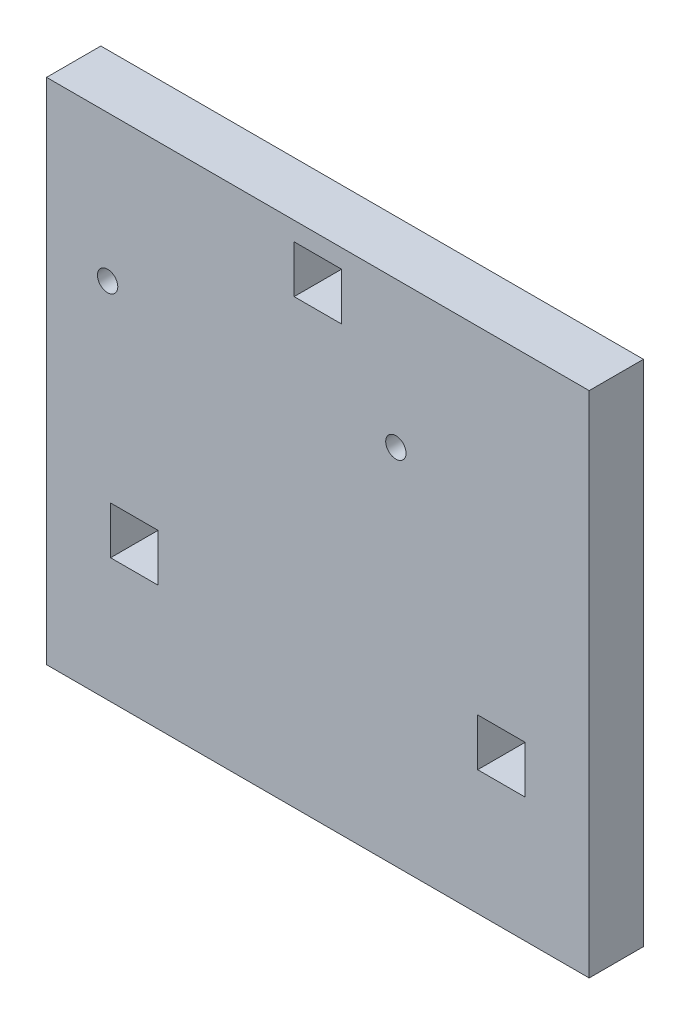
ISO-10303-21;
HEADER;
FILE_DESCRIPTION(('STEP AP214'),'2;1');
FILE_NAME('part.step','',(''),(''),'','','');
FILE_SCHEMA(('AUTOMOTIVE_DESIGN { 1 0 10303 214 1 1 1 1 }'));
ENDSEC;
DATA;
#1=APPLICATION_CONTEXT('core data for automotive mechanical design processes');
#2=APPLICATION_PROTOCOL_DEFINITION('international standard','automotive_design',2000,#1);
#3=PRODUCT_CONTEXT('',#1,'mechanical');
#4=PRODUCT('Part','Part','',(#3));
#5=PRODUCT_RELATED_PRODUCT_CATEGORY('part','',(#4));
#6=PRODUCT_DEFINITION_FORMATION('','',#4);
#7=PRODUCT_DEFINITION_CONTEXT('part definition',#1,'design');
#8=PRODUCT_DEFINITION('design','',#6,#7);
#9=PRODUCT_DEFINITION_SHAPE('','',#8);
#10=(LENGTH_UNIT() NAMED_UNIT(*) SI_UNIT(.MILLI.,.METRE.));
#11=(NAMED_UNIT(*) PLANE_ANGLE_UNIT() SI_UNIT($,.RADIAN.));
#12=(NAMED_UNIT(*) SI_UNIT($,.STERADIAN.) SOLID_ANGLE_UNIT());
#13=UNCERTAINTY_MEASURE_WITH_UNIT(LENGTH_MEASURE(1.E-05),#10,'distance_accuracy_value','');
#14=(GEOMETRIC_REPRESENTATION_CONTEXT(3) GLOBAL_UNCERTAINTY_ASSIGNED_CONTEXT((#13)) GLOBAL_UNIT_ASSIGNED_CONTEXT((#10,
#11,#12)) REPRESENTATION_CONTEXT('',''));
#15=CARTESIAN_POINT('',(0.,0.,0.));
#16=DIRECTION('',(0.,0.,1.));
#17=DIRECTION('',(1.,0.,0.));
#18=AXIS2_PLACEMENT_3D('',#15,#16,#17);
#19=CARTESIAN_POINT('',(0.,0.,16.));
#20=DIRECTION('',(-1.,0.,0.));
#21=DIRECTION('',(0.,-1.,0.));
#22=AXIS2_PLACEMENT_3D('',#19,#20,#21);
#23=PLANE('',#22);
#24=DIRECTION('',(0.,1.,0.));
#25=VECTOR('',#24,1.);
#26=CARTESIAN_POINT('',(0.,0.,0.));
#27=LINE('',#26,#25);
#28=CARTESIAN_POINT('',(0.,-150.,0.));
#29=VERTEX_POINT('',#28);
#30=CARTESIAN_POINT('',(0.,0.,0.));
#31=VERTEX_POINT('',#30);
#32=EDGE_CURVE('E186',#29,#31,#27,.T.);
#33=ORIENTED_EDGE('',*,*,#32,.T.);
#34=DIRECTION('',(0.,0.,-1.));
#35=VECTOR('',#34,1.);
#36=CARTESIAN_POINT('',(0.,0.,16.));
#37=LINE('',#36,#35);
#38=CARTESIAN_POINT('',(0.,0.,16.));
#39=VERTEX_POINT('',#38);
#40=EDGE_CURVE('E11',#39,#31,#37,.T.);
#41=ORIENTED_EDGE('',*,*,#40,.F.);
#42=DIRECTION('',(0.,1.,0.));
#43=VECTOR('',#42,1.);
#44=CARTESIAN_POINT('',(0.,0.,16.));
#45=LINE('',#44,#43);
#46=CARTESIAN_POINT('',(0.,-150.,16.));
#47=VERTEX_POINT('',#46);
#48=EDGE_CURVE('E252',#47,#39,#45,.T.);
#49=ORIENTED_EDGE('',*,*,#48,.F.);
#50=DIRECTION('',(0.,0.,-1.));
#51=VECTOR('',#50,1.);
#52=CARTESIAN_POINT('',(0.,-150.,16.));
#53=LINE('',#52,#51);
#54=EDGE_CURVE('E262',#47,#29,#53,.T.);
#55=ORIENTED_EDGE('',*,*,#54,.T.);
#56=EDGE_LOOP('',(#33,#41,#49,#55));
#57=FACE_BOUND('',#56,.T.);
#58=ADVANCED_FACE('F35',(#57),#23,.F.);
#59=CARTESIAN_POINT('',(0.,0.,16.));
#60=DIRECTION('',(0.,-1.,0.));
#61=DIRECTION('',(0.,0.,-1.));
#62=AXIS2_PLACEMENT_3D('',#59,#60,#61);
#63=PLANE('',#62);
#64=DIRECTION('',(-1.,0.,0.));
#65=VECTOR('',#64,1.);
#66=CARTESIAN_POINT('',(0.,0.,0.));
#67=LINE('',#66,#65);
#68=CARTESIAN_POINT('',(-160.,0.,0.));
#69=VERTEX_POINT('',#68);
#70=EDGE_CURVE('E265',#31,#69,#67,.T.);
#71=ORIENTED_EDGE('',*,*,#70,.T.);
#72=DIRECTION('',(0.,0.,-1.));
#73=VECTOR('',#72,1.);
#74=CARTESIAN_POINT('',(-160.,0.,16.));
#75=LINE('',#74,#73);
#76=CARTESIAN_POINT('',(-160.,0.,16.));
#77=VERTEX_POINT('',#76);
#78=EDGE_CURVE('E42',#77,#69,#75,.T.);
#79=ORIENTED_EDGE('',*,*,#78,.F.);
#80=DIRECTION('',(-1.,0.,0.));
#81=VECTOR('',#80,1.);
#82=CARTESIAN_POINT('',(0.,0.,16.));
#83=LINE('',#82,#81);
#84=EDGE_CURVE('E255',#39,#77,#83,.T.);
#85=ORIENTED_EDGE('',*,*,#84,.F.);
#86=ORIENTED_EDGE('',*,*,#40,.T.);
#87=EDGE_LOOP('',(#71,#79,#85,#86));
#88=FACE_BOUND('',#87,.T.);
#89=ADVANCED_FACE('F295',(#88),#63,.F.);
#90=CARTESIAN_POINT('',(-160.,0.,16.));
#91=DIRECTION('',(1.,0.,0.));
#92=DIRECTION('',(0.,1.,0.));
#93=AXIS2_PLACEMENT_3D('',#90,#91,#92);
#94=PLANE('',#93);
#95=DIRECTION('',(0.,-1.,0.));
#96=VECTOR('',#95,1.);
#97=CARTESIAN_POINT('',(-160.,0.,0.));
#98=LINE('',#97,#96);
#99=CARTESIAN_POINT('',(-160.,-150.,0.));
#100=VERTEX_POINT('',#99);
#101=EDGE_CURVE('E267',#69,#100,#98,.T.);
#102=ORIENTED_EDGE('',*,*,#101,.T.);
#103=DIRECTION('',(0.,0.,-1.));
#104=VECTOR('',#103,1.);
#105=CARTESIAN_POINT('',(-160.,-150.,16.));
#106=LINE('',#105,#104);
#107=CARTESIAN_POINT('',(-160.,-150.,16.));
#108=VERTEX_POINT('',#107);
#109=EDGE_CURVE('E272',#108,#100,#106,.T.);
#110=ORIENTED_EDGE('',*,*,#109,.F.);
#111=DIRECTION('',(0.,-1.,0.));
#112=VECTOR('',#111,1.);
#113=CARTESIAN_POINT('',(-160.,0.,16.));
#114=LINE('',#113,#112);
#115=EDGE_CURVE('E258',#77,#108,#114,.T.);
#116=ORIENTED_EDGE('',*,*,#115,.F.);
#117=ORIENTED_EDGE('',*,*,#78,.T.);
#118=EDGE_LOOP('',(#102,#110,#116,#117));
#119=FACE_BOUND('',#118,.T.);
#120=ADVANCED_FACE('F279',(#119),#94,.F.);
#121=CARTESIAN_POINT('',(0.,-150.,16.));
#122=DIRECTION('',(0.,1.,0.));
#123=DIRECTION('',(-1.,0.,0.));
#124=AXIS2_PLACEMENT_3D('',#121,#122,#123);
#125=PLANE('',#124);
#126=DIRECTION('',(1.,0.,0.));
#127=VECTOR('',#126,1.);
#128=CARTESIAN_POINT('',(0.,-150.,0.));
#129=LINE('',#128,#127);
#130=EDGE_CURVE('E256',#100,#29,#129,.T.);
#131=ORIENTED_EDGE('',*,*,#130,.T.);
#132=ORIENTED_EDGE('',*,*,#54,.F.);
#133=DIRECTION('',(1.,0.,0.));
#134=VECTOR('',#133,1.);
#135=CARTESIAN_POINT('',(0.,-150.,16.));
#136=LINE('',#135,#134);
#137=EDGE_CURVE('E260',#108,#47,#136,.T.);
#138=ORIENTED_EDGE('',*,*,#137,.F.);
#139=ORIENTED_EDGE('',*,*,#109,.T.);
#140=EDGE_LOOP('',(#131,#132,#138,#139));
#141=FACE_BOUND('',#140,.T.);
#142=ADVANCED_FACE('F288',(#141),#125,.F.);
#143=CARTESIAN_POINT('',(0.,0.,16.));
#144=DIRECTION('',(0.,0.,-1.));
#145=DIRECTION('',(-1.,0.,0.));
#146=AXIS2_PLACEMENT_3D('',#143,#144,#145);
#147=PLANE('',#146);
#148=CARTESIAN_POINT('',(-57.,-43.,16.));
#149=DIRECTION('',(0.,0.,1.));
#150=DIRECTION('',(1.,0.,0.));
#151=AXIS2_PLACEMENT_3D('',#148,#149,#150);
#152=CIRCLE('',#151,3.);
#153=CARTESIAN_POINT('',(-54.,-43.,16.));
#154=VERTEX_POINT('',#153);
#155=EDGE_CURVE('E378',#154,#154,#152,.T.);
#156=ORIENTED_EDGE('',*,*,#155,.F.);
#157=EDGE_LOOP('',(#156));
#158=FACE_BOUND('',#157,.T.);
#159=CARTESIAN_POINT('',(-142.,-43.,16.));
#160=DIRECTION('',(0.,0.,1.));
#161=DIRECTION('',(1.,0.,0.));
#162=AXIS2_PLACEMENT_3D('',#159,#160,#161);
#163=CIRCLE('',#162,2.99999999999999);
#164=CARTESIAN_POINT('',(-139.,-43.,16.));
#165=VERTEX_POINT('',#164);
#166=EDGE_CURVE('E173',#165,#165,#163,.T.);
#167=ORIENTED_EDGE('',*,*,#166,.F.);
#168=EDGE_LOOP('',(#167));
#169=FACE_BOUND('',#168,.T.);
#170=DIRECTION('',(1.,0.,0.));
#171=VECTOR('',#170,1.);
#172=CARTESIAN_POINT('',(-73.,-19.5,16.));
#173=LINE('',#172,#171);
#174=CARTESIAN_POINT('',(-87.,-19.5,16.));
#175=VERTEX_POINT('',#174);
#176=CARTESIAN_POINT('',(-73.,-19.5,16.));
#177=VERTEX_POINT('',#176);
#178=EDGE_CURVE('E179',#175,#177,#173,.T.);
#179=ORIENTED_EDGE('',*,*,#178,.F.);
#180=DIRECTION('',(0.,-1.,0.));
#181=VECTOR('',#180,1.);
#182=CARTESIAN_POINT('',(-87.,-5.50000000000002,16.));
#183=LINE('',#182,#181);
#184=CARTESIAN_POINT('',(-87.,-5.50000000000002,16.));
#185=VERTEX_POINT('',#184);
#186=EDGE_CURVE('E49',#185,#175,#183,.T.);
#187=ORIENTED_EDGE('',*,*,#186,.F.);
#188=DIRECTION('',(-1.,0.,0.));
#189=VECTOR('',#188,1.);
#190=CARTESIAN_POINT('',(-73.,-5.50000000000002,16.));
#191=LINE('',#190,#189);
#192=CARTESIAN_POINT('',(-73.,-5.50000000000002,16.));
#193=VERTEX_POINT('',#192);
#194=EDGE_CURVE('E167',#193,#185,#191,.T.);
#195=ORIENTED_EDGE('',*,*,#194,.F.);
#196=DIRECTION('',(0.,1.,0.));
#197=VECTOR('',#196,1.);
#198=CARTESIAN_POINT('',(-73.,-5.50000000000002,16.));
#199=LINE('',#198,#197);
#200=EDGE_CURVE('E170',#177,#193,#199,.T.);
#201=ORIENTED_EDGE('',*,*,#200,.F.);
#202=EDGE_LOOP('',(#179,#187,#195,#201));
#203=FACE_BOUND('',#202,.T.);
#204=DIRECTION('',(1.,0.,0.));
#205=VECTOR('',#204,1.);
#206=CARTESIAN_POINT('',(-127.126587736527,-113.25,16.));
#207=LINE('',#206,#205);
#208=CARTESIAN_POINT('',(-141.126587736527,-113.25,16.));
#209=VERTEX_POINT('',#208);
#210=CARTESIAN_POINT('',(-127.126587736527,-113.25,16.));
#211=VERTEX_POINT('',#210);
#212=EDGE_CURVE('E205',#209,#211,#207,.T.);
#213=ORIENTED_EDGE('',*,*,#212,.F.);
#214=DIRECTION('',(0.,-1.,0.));
#215=VECTOR('',#214,1.);
#216=CARTESIAN_POINT('',(-141.126587736527,-113.25,16.));
#217=LINE('',#216,#215);
#218=CARTESIAN_POINT('',(-141.126587736527,-99.25,16.));
#219=VERTEX_POINT('',#218);
#220=EDGE_CURVE('E57',#219,#209,#217,.T.);
#221=ORIENTED_EDGE('',*,*,#220,.F.);
#222=DIRECTION('',(-1.,0.,0.));
#223=VECTOR('',#222,1.);
#224=CARTESIAN_POINT('',(-127.126587736527,-99.25,16.));
#225=LINE('',#224,#223);
#226=CARTESIAN_POINT('',(-127.126587736527,-99.25,16.));
#227=VERTEX_POINT('',#226);
#228=EDGE_CURVE('E194',#227,#219,#225,.T.);
#229=ORIENTED_EDGE('',*,*,#228,.F.);
#230=DIRECTION('',(0.,1.,0.));
#231=VECTOR('',#230,1.);
#232=CARTESIAN_POINT('',(-127.126587736527,-113.25,16.));
#233=LINE('',#232,#231);
#234=EDGE_CURVE('E209',#211,#227,#233,.T.);
#235=ORIENTED_EDGE('',*,*,#234,.F.);
#236=EDGE_LOOP('',(#213,#221,#229,#235));
#237=FACE_BOUND('',#236,.T.);
#238=DIRECTION('',(1.,0.,0.));
#239=VECTOR('',#238,1.);
#240=CARTESIAN_POINT('',(-18.8734122634726,-113.25,16.));
#241=LINE('',#240,#239);
#242=CARTESIAN_POINT('',(-32.8734122634726,-113.25,16.));
#243=VERTEX_POINT('',#242);
#244=CARTESIAN_POINT('',(-18.8734122634726,-113.25,16.));
#245=VERTEX_POINT('',#244);
#246=EDGE_CURVE('E236',#243,#245,#241,.T.);
#247=ORIENTED_EDGE('',*,*,#246,.F.);
#248=DIRECTION('',(0.,-1.,0.));
#249=VECTOR('',#248,1.);
#250=CARTESIAN_POINT('',(-32.8734122634726,-113.25,16.));
#251=LINE('',#250,#249);
#252=CARTESIAN_POINT('',(-32.8734122634726,-99.25,16.));
#253=VERTEX_POINT('',#252);
#254=EDGE_CURVE('E234',#253,#243,#251,.T.);
#255=ORIENTED_EDGE('',*,*,#254,.F.);
#256=DIRECTION('',(-1.,0.,0.));
#257=VECTOR('',#256,1.);
#258=CARTESIAN_POINT('',(-18.8734122634726,-99.25,16.));
#259=LINE('',#258,#257);
#260=CARTESIAN_POINT('',(-18.8734122634726,-99.25,16.));
#261=VERTEX_POINT('',#260);
#262=EDGE_CURVE('E224',#261,#253,#259,.T.);
#263=ORIENTED_EDGE('',*,*,#262,.F.);
#264=DIRECTION('',(0.,1.,0.));
#265=VECTOR('',#264,1.);
#266=CARTESIAN_POINT('',(-18.8734122634726,-113.25,16.));
#267=LINE('',#266,#265);
#268=EDGE_CURVE('E240',#245,#261,#267,.T.);
#269=ORIENTED_EDGE('',*,*,#268,.F.);
#270=EDGE_LOOP('',(#247,#255,#263,#269));
#271=FACE_BOUND('',#270,.T.);
#272=ORIENTED_EDGE('',*,*,#48,.T.);
#273=ORIENTED_EDGE('',*,*,#84,.T.);
#274=ORIENTED_EDGE('',*,*,#115,.T.);
#275=ORIENTED_EDGE('',*,*,#137,.T.);
#276=EDGE_LOOP('',(#272,#273,#274,#275));
#277=FACE_BOUND('',#276,.T.);
#278=ADVANCED_FACE('F294',(#158,#169,#203,#237,#271,#277),#147,.F.);
#279=CARTESIAN_POINT('',(0.,0.,0.));
#280=DIRECTION('',(0.,0.,-1.));
#281=DIRECTION('',(-1.,0.,0.));
#282=AXIS2_PLACEMENT_3D('',#279,#280,#281);
#283=PLANE('',#282);
#284=CARTESIAN_POINT('',(-57.,-43.,0.));
#285=DIRECTION('',(0.,0.,1.));
#286=DIRECTION('',(1.,0.,0.));
#287=AXIS2_PLACEMENT_3D('',#284,#285,#286);
#288=CIRCLE('',#287,3.);
#289=CARTESIAN_POINT('',(-54.,-43.,0.));
#290=VERTEX_POINT('',#289);
#291=EDGE_CURVE('E237',#290,#290,#288,.T.);
#292=ORIENTED_EDGE('',*,*,#291,.T.);
#293=EDGE_LOOP('',(#292));
#294=FACE_BOUND('',#293,.T.);
#295=CARTESIAN_POINT('',(-142.,-43.,0.));
#296=DIRECTION('',(0.,0.,1.));
#297=DIRECTION('',(1.,0.,0.));
#298=AXIS2_PLACEMENT_3D('',#295,#296,#297);
#299=CIRCLE('',#298,2.99999999999999);
#300=CARTESIAN_POINT('',(-139.,-43.,0.));
#301=VERTEX_POINT('',#300);
#302=EDGE_CURVE('E379',#301,#301,#299,.T.);
#303=ORIENTED_EDGE('',*,*,#302,.T.);
#304=EDGE_LOOP('',(#303));
#305=FACE_BOUND('',#304,.T.);
#306=ORIENTED_EDGE('',*,*,#32,.F.);
#307=ORIENTED_EDGE('',*,*,#130,.F.);
#308=ORIENTED_EDGE('',*,*,#101,.F.);
#309=ORIENTED_EDGE('',*,*,#70,.F.);
#310=EDGE_LOOP('',(#306,#307,#308,#309));
#311=FACE_BOUND('',#310,.T.);
#312=ADVANCED_FACE('F285',(#294,#305,#311),#283,.T.);
#313=CARTESIAN_POINT('',(-32.8734122634726,-113.25,2.));
#314=DIRECTION('',(-1.,0.,0.));
#315=DIRECTION('',(0.,0.,1.));
#316=AXIS2_PLACEMENT_3D('',#313,#314,#315);
#317=PLANE('',#316);
#318=ORIENTED_EDGE('',*,*,#254,.T.);
#319=DIRECTION('',(0.,0.,1.));
#320=VECTOR('',#319,1.);
#321=CARTESIAN_POINT('',(-32.8734122634726,-113.25,2.));
#322=LINE('',#321,#320);
#323=CARTESIAN_POINT('',(-32.8734122634726,-113.25,2.));
#324=VERTEX_POINT('',#323);
#325=EDGE_CURVE('E233',#324,#243,#322,.T.);
#326=ORIENTED_EDGE('',*,*,#325,.F.);
#327=DIRECTION('',(0.,-1.,0.));
#328=VECTOR('',#327,1.);
#329=CARTESIAN_POINT('',(-32.8734122634726,-113.25,2.));
#330=LINE('',#329,#328);
#331=CARTESIAN_POINT('',(-32.8734122634726,-99.25,2.));
#332=VERTEX_POINT('',#331);
#333=EDGE_CURVE('E220',#332,#324,#330,.T.);
#334=ORIENTED_EDGE('',*,*,#333,.F.);
#335=DIRECTION('',(0.,0.,1.));
#336=VECTOR('',#335,1.);
#337=CARTESIAN_POINT('',(-32.8734122634726,-99.25,2.));
#338=LINE('',#337,#336);
#339=EDGE_CURVE('E206',#332,#253,#338,.T.);
#340=ORIENTED_EDGE('',*,*,#339,.T.);
#341=EDGE_LOOP('',(#318,#326,#334,#340));
#342=FACE_BOUND('',#341,.T.);
#343=ADVANCED_FACE('F307',(#342),#317,.F.);
#344=CARTESIAN_POINT('',(-18.8734122634726,-99.25,2.));
#345=DIRECTION('',(0.,1.,0.));
#346=DIRECTION('',(0.,0.,1.));
#347=AXIS2_PLACEMENT_3D('',#344,#345,#346);
#348=PLANE('',#347);
#349=ORIENTED_EDGE('',*,*,#262,.T.);
#350=ORIENTED_EDGE('',*,*,#339,.F.);
#351=DIRECTION('',(-1.,0.,0.));
#352=VECTOR('',#351,1.);
#353=CARTESIAN_POINT('',(-18.8734122634726,-99.25,2.));
#354=LINE('',#353,#352);
#355=CARTESIAN_POINT('',(-18.8734122634726,-99.25,2.));
#356=VERTEX_POINT('',#355);
#357=EDGE_CURVE('E230',#356,#332,#354,.T.);
#358=ORIENTED_EDGE('',*,*,#357,.F.);
#359=DIRECTION('',(0.,0.,1.));
#360=VECTOR('',#359,1.);
#361=CARTESIAN_POINT('',(-18.8734122634726,-99.25,2.));
#362=LINE('',#361,#360);
#363=EDGE_CURVE('E246',#356,#261,#362,.T.);
#364=ORIENTED_EDGE('',*,*,#363,.T.);
#365=EDGE_LOOP('',(#349,#350,#358,#364));
#366=FACE_BOUND('',#365,.T.);
#367=ADVANCED_FACE('F314',(#366),#348,.F.);
#368=CARTESIAN_POINT('',(-18.8734122634726,-113.25,2.));
#369=DIRECTION('',(1.,0.,0.));
#370=DIRECTION('',(0.,0.,-1.));
#371=AXIS2_PLACEMENT_3D('',#368,#369,#370);
#372=PLANE('',#371);
#373=ORIENTED_EDGE('',*,*,#268,.T.);
#374=ORIENTED_EDGE('',*,*,#363,.F.);
#375=DIRECTION('',(0.,1.,0.));
#376=VECTOR('',#375,1.);
#377=CARTESIAN_POINT('',(-18.8734122634726,-113.25,2.));
#378=LINE('',#377,#376);
#379=CARTESIAN_POINT('',(-18.8734122634726,-113.25,2.));
#380=VERTEX_POINT('',#379);
#381=EDGE_CURVE('E227',#380,#356,#378,.T.);
#382=ORIENTED_EDGE('',*,*,#381,.F.);
#383=DIRECTION('',(0.,0.,1.));
#384=VECTOR('',#383,1.);
#385=CARTESIAN_POINT('',(-18.8734122634726,-113.25,2.));
#386=LINE('',#385,#384);
#387=EDGE_CURVE('E248',#380,#245,#386,.T.);
#388=ORIENTED_EDGE('',*,*,#387,.T.);
#389=EDGE_LOOP('',(#373,#374,#382,#388));
#390=FACE_BOUND('',#389,.T.);
#391=ADVANCED_FACE('F320',(#390),#372,.F.);
#392=CARTESIAN_POINT('',(-18.8734122634726,-113.25,2.));
#393=DIRECTION('',(0.,-1.,0.));
#394=DIRECTION('',(0.,0.,-1.));
#395=AXIS2_PLACEMENT_3D('',#392,#393,#394);
#396=PLANE('',#395);
#397=ORIENTED_EDGE('',*,*,#246,.T.);
#398=ORIENTED_EDGE('',*,*,#387,.F.);
#399=DIRECTION('',(1.,0.,0.));
#400=VECTOR('',#399,1.);
#401=CARTESIAN_POINT('',(-18.8734122634726,-113.25,2.));
#402=LINE('',#401,#400);
#403=EDGE_CURVE('E223',#324,#380,#402,.T.);
#404=ORIENTED_EDGE('',*,*,#403,.F.);
#405=ORIENTED_EDGE('',*,*,#325,.T.);
#406=EDGE_LOOP('',(#397,#398,#404,#405));
#407=FACE_BOUND('',#406,.T.);
#408=ADVANCED_FACE('F316',(#407),#396,.F.);
#409=CARTESIAN_POINT('',(0.,0.,2.));
#410=DIRECTION('',(0.,0.,1.));
#411=DIRECTION('',(1.,0.,0.));
#412=AXIS2_PLACEMENT_3D('',#409,#410,#411);
#413=PLANE('',#412);
#414=ORIENTED_EDGE('',*,*,#333,.T.);
#415=ORIENTED_EDGE('',*,*,#403,.T.);
#416=ORIENTED_EDGE('',*,*,#381,.T.);
#417=ORIENTED_EDGE('',*,*,#357,.T.);
#418=EDGE_LOOP('',(#414,#415,#416,#417));
#419=FACE_BOUND('',#418,.T.);
#420=ADVANCED_FACE('F319',(#419),#413,.T.);
#421=CARTESIAN_POINT('',(-141.126587736527,-113.25,2.));
#422=DIRECTION('',(-1.,0.,0.));
#423=DIRECTION('',(0.,0.,1.));
#424=AXIS2_PLACEMENT_3D('',#421,#422,#423);
#425=PLANE('',#424);
#426=ORIENTED_EDGE('',*,*,#220,.T.);
#427=DIRECTION('',(0.,0.,1.));
#428=VECTOR('',#427,1.);
#429=CARTESIAN_POINT('',(-141.126587736527,-113.25,2.));
#430=LINE('',#429,#428);
#431=CARTESIAN_POINT('',(-141.126587736527,-113.25,2.));
#432=VERTEX_POINT('',#431);
#433=EDGE_CURVE('E203',#432,#209,#430,.T.);
#434=ORIENTED_EDGE('',*,*,#433,.F.);
#435=DIRECTION('',(0.,-1.,0.));
#436=VECTOR('',#435,1.);
#437=CARTESIAN_POINT('',(-141.126587736527,-113.25,2.));
#438=LINE('',#437,#436);
#439=CARTESIAN_POINT('',(-141.126587736527,-99.25,2.));
#440=VERTEX_POINT('',#439);
#441=EDGE_CURVE('E190',#440,#432,#438,.T.);
#442=ORIENTED_EDGE('',*,*,#441,.F.);
#443=DIRECTION('',(0.,0.,1.));
#444=VECTOR('',#443,1.);
#445=CARTESIAN_POINT('',(-141.126587736527,-99.25,2.));
#446=LINE('',#445,#444);
#447=EDGE_CURVE('E180',#440,#219,#446,.T.);
#448=ORIENTED_EDGE('',*,*,#447,.T.);
#449=EDGE_LOOP('',(#426,#434,#442,#448));
#450=FACE_BOUND('',#449,.T.);
#451=ADVANCED_FACE('F330',(#450),#425,.F.);
#452=CARTESIAN_POINT('',(-127.126587736527,-99.25,2.));
#453=DIRECTION('',(0.,1.,0.));
#454=DIRECTION('',(0.,0.,1.));
#455=AXIS2_PLACEMENT_3D('',#452,#453,#454);
#456=PLANE('',#455);
#457=ORIENTED_EDGE('',*,*,#228,.T.);
#458=ORIENTED_EDGE('',*,*,#447,.F.);
#459=DIRECTION('',(-1.,0.,0.));
#460=VECTOR('',#459,1.);
#461=CARTESIAN_POINT('',(-127.126587736527,-99.25,2.));
#462=LINE('',#461,#460);
#463=CARTESIAN_POINT('',(-127.126587736527,-99.25,2.));
#464=VERTEX_POINT('',#463);
#465=EDGE_CURVE('E200',#464,#440,#462,.T.);
#466=ORIENTED_EDGE('',*,*,#465,.F.);
#467=DIRECTION('',(0.,0.,1.));
#468=VECTOR('',#467,1.);
#469=CARTESIAN_POINT('',(-127.126587736527,-99.25,2.));
#470=LINE('',#469,#468);
#471=EDGE_CURVE('E215',#464,#227,#470,.T.);
#472=ORIENTED_EDGE('',*,*,#471,.T.);
#473=EDGE_LOOP('',(#457,#458,#466,#472));
#474=FACE_BOUND('',#473,.T.);
#475=ADVANCED_FACE('F334',(#474),#456,.F.);
#476=CARTESIAN_POINT('',(-127.126587736527,-113.25,2.));
#477=DIRECTION('',(1.,0.,0.));
#478=DIRECTION('',(0.,0.,-1.));
#479=AXIS2_PLACEMENT_3D('',#476,#477,#478);
#480=PLANE('',#479);
#481=ORIENTED_EDGE('',*,*,#234,.T.);
#482=ORIENTED_EDGE('',*,*,#471,.F.);
#483=DIRECTION('',(0.,1.,0.));
#484=VECTOR('',#483,1.);
#485=CARTESIAN_POINT('',(-127.126587736527,-113.25,2.));
#486=LINE('',#485,#484);
#487=CARTESIAN_POINT('',(-127.126587736527,-113.25,2.));
#488=VERTEX_POINT('',#487);
#489=EDGE_CURVE('E197',#488,#464,#486,.T.);
#490=ORIENTED_EDGE('',*,*,#489,.F.);
#491=DIRECTION('',(0.,0.,1.));
#492=VECTOR('',#491,1.);
#493=CARTESIAN_POINT('',(-127.126587736527,-113.25,2.));
#494=LINE('',#493,#492);
#495=EDGE_CURVE('E217',#488,#211,#494,.T.);
#496=ORIENTED_EDGE('',*,*,#495,.T.);
#497=EDGE_LOOP('',(#481,#482,#490,#496));
#498=FACE_BOUND('',#497,.T.);
#499=ADVANCED_FACE('F339',(#498),#480,.F.);
#500=CARTESIAN_POINT('',(-127.126587736527,-113.25,2.));
#501=DIRECTION('',(0.,-1.,0.));
#502=DIRECTION('',(0.,0.,-1.));
#503=AXIS2_PLACEMENT_3D('',#500,#501,#502);
#504=PLANE('',#503);
#505=ORIENTED_EDGE('',*,*,#212,.T.);
#506=ORIENTED_EDGE('',*,*,#495,.F.);
#507=DIRECTION('',(1.,0.,0.));
#508=VECTOR('',#507,1.);
#509=CARTESIAN_POINT('',(-127.126587736527,-113.25,2.));
#510=LINE('',#509,#508);
#511=EDGE_CURVE('E193',#432,#488,#510,.T.);
#512=ORIENTED_EDGE('',*,*,#511,.F.);
#513=ORIENTED_EDGE('',*,*,#433,.T.);
#514=EDGE_LOOP('',(#505,#506,#512,#513));
#515=FACE_BOUND('',#514,.T.);
#516=ADVANCED_FACE('F335',(#515),#504,.F.);
#517=CARTESIAN_POINT('',(0.,0.,2.));
#518=DIRECTION('',(0.,0.,1.));
#519=DIRECTION('',(1.,0.,0.));
#520=AXIS2_PLACEMENT_3D('',#517,#518,#519);
#521=PLANE('',#520);
#522=ORIENTED_EDGE('',*,*,#441,.T.);
#523=ORIENTED_EDGE('',*,*,#511,.T.);
#524=ORIENTED_EDGE('',*,*,#489,.T.);
#525=ORIENTED_EDGE('',*,*,#465,.T.);
#526=EDGE_LOOP('',(#522,#523,#524,#525));
#527=FACE_BOUND('',#526,.T.);
#528=ADVANCED_FACE('F338',(#527),#521,.T.);
#529=CARTESIAN_POINT('',(-87.,-5.50000000000002,2.));
#530=DIRECTION('',(-1.,0.,0.));
#531=DIRECTION('',(0.,0.,1.));
#532=AXIS2_PLACEMENT_3D('',#529,#530,#531);
#533=PLANE('',#532);
#534=ORIENTED_EDGE('',*,*,#186,.T.);
#535=DIRECTION('',(0.,0.,1.));
#536=VECTOR('',#535,1.);
#537=CARTESIAN_POINT('',(-87.,-19.5,2.));
#538=LINE('',#537,#536);
#539=CARTESIAN_POINT('',(-87.,-19.5,2.));
#540=VERTEX_POINT('',#539);
#541=EDGE_CURVE('E145',#540,#175,#538,.T.);
#542=ORIENTED_EDGE('',*,*,#541,.F.);
#543=DIRECTION('',(0.,-1.,0.));
#544=VECTOR('',#543,1.);
#545=CARTESIAN_POINT('',(-87.,-5.50000000000002,2.));
#546=LINE('',#545,#544);
#547=CARTESIAN_POINT('',(-87.,-5.50000000000002,2.));
#548=VERTEX_POINT('',#547);
#549=EDGE_CURVE('E149',#548,#540,#546,.T.);
#550=ORIENTED_EDGE('',*,*,#549,.F.);
#551=DIRECTION('',(0.,0.,1.));
#552=VECTOR('',#551,1.);
#553=CARTESIAN_POINT('',(-87.,-5.50000000000002,2.));
#554=LINE('',#553,#552);
#555=EDGE_CURVE('E184',#548,#185,#554,.T.);
#556=ORIENTED_EDGE('',*,*,#555,.T.);
#557=EDGE_LOOP('',(#534,#542,#550,#556));
#558=FACE_BOUND('',#557,.T.);
#559=ADVANCED_FACE('F147',(#558),#533,.F.);
#560=CARTESIAN_POINT('',(-73.,-5.50000000000002,2.));
#561=DIRECTION('',(0.,1.,0.));
#562=DIRECTION('',(-1.,0.,0.));
#563=AXIS2_PLACEMENT_3D('',#560,#561,#562);
#564=PLANE('',#563);
#565=ORIENTED_EDGE('',*,*,#194,.T.);
#566=ORIENTED_EDGE('',*,*,#555,.F.);
#567=DIRECTION('',(-1.,0.,0.));
#568=VECTOR('',#567,1.);
#569=CARTESIAN_POINT('',(-73.,-5.50000000000002,2.));
#570=LINE('',#569,#568);
#571=CARTESIAN_POINT('',(-73.,-5.50000000000002,2.));
#572=VERTEX_POINT('',#571);
#573=EDGE_CURVE('E155',#572,#548,#570,.T.);
#574=ORIENTED_EDGE('',*,*,#573,.F.);
#575=DIRECTION('',(0.,0.,1.));
#576=VECTOR('',#575,1.);
#577=CARTESIAN_POINT('',(-73.,-5.50000000000002,2.));
#578=LINE('',#577,#576);
#579=EDGE_CURVE('E187',#572,#193,#578,.T.);
#580=ORIENTED_EDGE('',*,*,#579,.T.);
#581=EDGE_LOOP('',(#565,#566,#574,#580));
#582=FACE_BOUND('',#581,.T.);
#583=ADVANCED_FACE('F352',(#582),#564,.F.);
#584=CARTESIAN_POINT('',(-73.,-5.50000000000002,2.));
#585=DIRECTION('',(1.,0.,0.));
#586=DIRECTION('',(0.,0.,-1.));
#587=AXIS2_PLACEMENT_3D('',#584,#585,#586);
#588=PLANE('',#587);
#589=ORIENTED_EDGE('',*,*,#200,.T.);
#590=ORIENTED_EDGE('',*,*,#579,.F.);
#591=DIRECTION('',(0.,1.,0.));
#592=VECTOR('',#591,1.);
#593=CARTESIAN_POINT('',(-73.,-5.50000000000002,2.));
#594=LINE('',#593,#592);
#595=CARTESIAN_POINT('',(-73.,-19.5,2.));
#596=VERTEX_POINT('',#595);
#597=EDGE_CURVE('E163',#596,#572,#594,.T.);
#598=ORIENTED_EDGE('',*,*,#597,.F.);
#599=DIRECTION('',(0.,0.,1.));
#600=VECTOR('',#599,1.);
#601=CARTESIAN_POINT('',(-73.,-19.5,2.));
#602=LINE('',#601,#600);
#603=EDGE_CURVE('E154',#596,#177,#602,.T.);
#604=ORIENTED_EDGE('',*,*,#603,.T.);
#605=EDGE_LOOP('',(#589,#590,#598,#604));
#606=FACE_BOUND('',#605,.T.);
#607=ADVANCED_FACE('F355',(#606),#588,.F.);
#608=CARTESIAN_POINT('',(-73.,-19.5,2.));
#609=DIRECTION('',(0.,-1.,0.));
#610=DIRECTION('',(0.,0.,-1.));
#611=AXIS2_PLACEMENT_3D('',#608,#609,#610);
#612=PLANE('',#611);
#613=ORIENTED_EDGE('',*,*,#178,.T.);
#614=ORIENTED_EDGE('',*,*,#603,.F.);
#615=DIRECTION('',(1.,0.,0.));
#616=VECTOR('',#615,1.);
#617=CARTESIAN_POINT('',(-73.,-19.5,2.));
#618=LINE('',#617,#616);
#619=EDGE_CURVE('E158',#540,#596,#618,.T.);
#620=ORIENTED_EDGE('',*,*,#619,.F.);
#621=ORIENTED_EDGE('',*,*,#541,.T.);
#622=EDGE_LOOP('',(#613,#614,#620,#621));
#623=FACE_BOUND('',#622,.T.);
#624=ADVANCED_FACE('F159',(#623),#612,.F.);
#625=CARTESIAN_POINT('',(0.,0.,2.));
#626=DIRECTION('',(0.,0.,-1.));
#627=DIRECTION('',(-1.,0.,0.));
#628=AXIS2_PLACEMENT_3D('',#625,#626,#627);
#629=PLANE('',#628);
#630=ORIENTED_EDGE('',*,*,#549,.T.);
#631=ORIENTED_EDGE('',*,*,#619,.T.);
#632=ORIENTED_EDGE('',*,*,#597,.T.);
#633=ORIENTED_EDGE('',*,*,#573,.T.);
#634=EDGE_LOOP('',(#630,#631,#632,#633));
#635=FACE_BOUND('',#634,.T.);
#636=ADVANCED_FACE('F165',(#635),#629,.F.);
#637=CARTESIAN_POINT('',(-142.,-43.,0.));
#638=DIRECTION('',(0.,0.,1.));
#639=DIRECTION('',(1.,0.,0.));
#640=AXIS2_PLACEMENT_3D('',#637,#638,#639);
#641=CYLINDRICAL_SURFACE('',#640,2.99999999999999);
#642=ORIENTED_EDGE('',*,*,#302,.F.);
#643=EDGE_LOOP('',(#642));
#644=FACE_BOUND('',#643,.T.);
#645=ORIENTED_EDGE('',*,*,#166,.T.);
#646=EDGE_LOOP('',(#645));
#647=FACE_BOUND('',#646,.T.);
#648=ADVANCED_FACE('F364',(#644,#647),#641,.F.);
#649=CARTESIAN_POINT('',(-57.,-43.,0.));
#650=DIRECTION('',(0.,0.,1.));
#651=DIRECTION('',(1.,0.,0.));
#652=AXIS2_PLACEMENT_3D('',#649,#650,#651);
#653=CYLINDRICAL_SURFACE('',#652,3.);
#654=ORIENTED_EDGE('',*,*,#291,.F.);
#655=EDGE_LOOP('',(#654));
#656=FACE_BOUND('',#655,.T.);
#657=ORIENTED_EDGE('',*,*,#155,.T.);
#658=EDGE_LOOP('',(#657));
#659=FACE_BOUND('',#658,.T.);
#660=ADVANCED_FACE('F367',(#656,#659),#653,.F.);
#661=CLOSED_SHELL('',(#58,#89,#120,#142,#278,#312,#343,#367,#391,#408,#420,#451,#475,#499,#516,
#528,#559,#583,#607,#624,#636,#648,#660));
#662=MANIFOLD_SOLID_BREP('B2',#661);
#663=ADVANCED_BREP_SHAPE_REPRESENTATION('',(#18,#662),#14);
#664=SHAPE_DEFINITION_REPRESENTATION(#9,#663);
ENDSEC;
END-ISO-10303-21;
